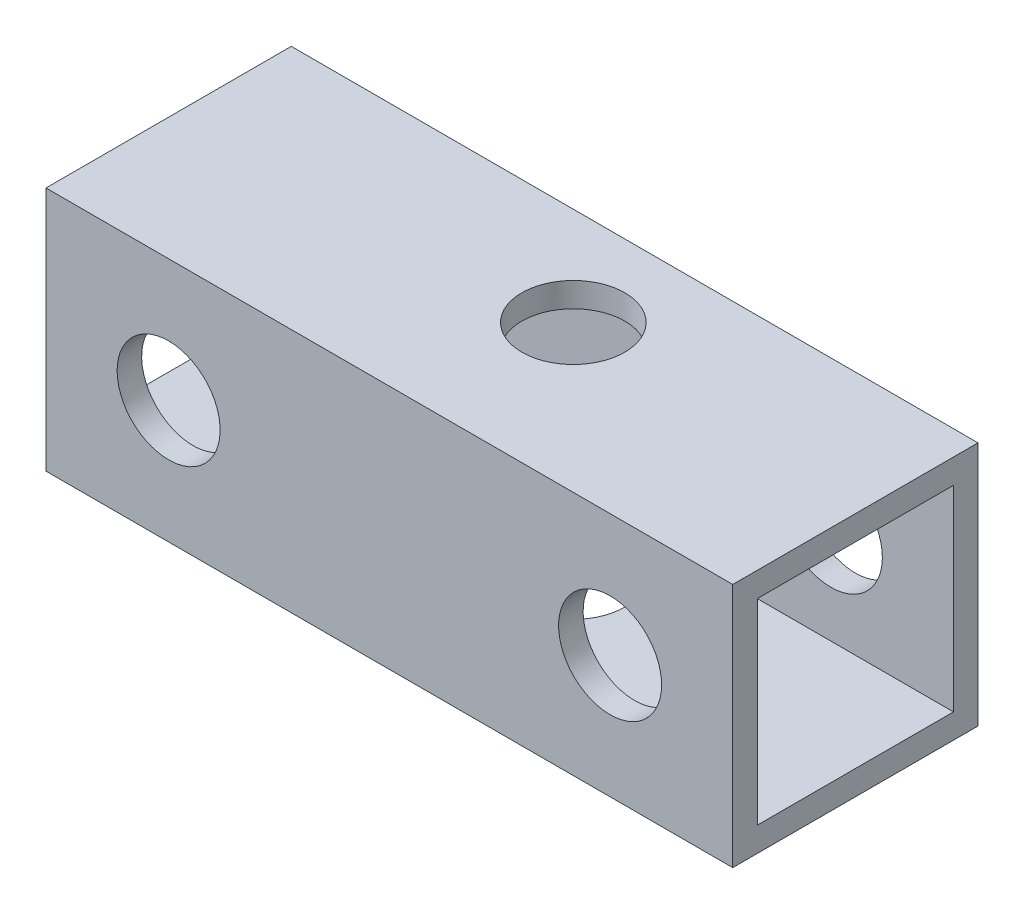
ISO-10303-21;
HEADER;
FILE_DESCRIPTION(('STEP AP214'),'2;1');
FILE_NAME('part.step','',(''),(''),'','','');
FILE_SCHEMA(('AUTOMOTIVE_DESIGN { 1 0 10303 214 1 1 1 1 }'));
ENDSEC;
DATA;
#1=APPLICATION_CONTEXT('core data for automotive mechanical design processes');
#2=APPLICATION_PROTOCOL_DEFINITION('international standard','automotive_design',2000,#1);
#3=PRODUCT_CONTEXT('',#1,'mechanical');
#4=PRODUCT('Part','Part','',(#3));
#5=PRODUCT_RELATED_PRODUCT_CATEGORY('part','',(#4));
#6=PRODUCT_DEFINITION_FORMATION('','',#4);
#7=PRODUCT_DEFINITION_CONTEXT('part definition',#1,'design');
#8=PRODUCT_DEFINITION('design','',#6,#7);
#9=PRODUCT_DEFINITION_SHAPE('','',#8);
#10=(LENGTH_UNIT() NAMED_UNIT(*) SI_UNIT(.MILLI.,.METRE.));
#11=(NAMED_UNIT(*) PLANE_ANGLE_UNIT() SI_UNIT($,.RADIAN.));
#12=(NAMED_UNIT(*) SI_UNIT($,.STERADIAN.) SOLID_ANGLE_UNIT());
#13=UNCERTAINTY_MEASURE_WITH_UNIT(LENGTH_MEASURE(1.E-05),#10,'distance_accuracy_value','');
#14=(GEOMETRIC_REPRESENTATION_CONTEXT(3) GLOBAL_UNCERTAINTY_ASSIGNED_CONTEXT((#13)) GLOBAL_UNIT_ASSIGNED_CONTEXT((#10,
#11,#12)) REPRESENTATION_CONTEXT('',''));
#15=CARTESIAN_POINT('',(0.,0.,0.));
#16=DIRECTION('',(0.,0.,1.));
#17=DIRECTION('',(1.,0.,0.));
#18=AXIS2_PLACEMENT_3D('',#15,#16,#17);
#19=CARTESIAN_POINT('',(28.,5.,-4.));
#20=DIRECTION('',(0.,0.,1.));
#21=DIRECTION('',(0.,-1.,0.));
#22=AXIS2_PLACEMENT_3D('',#19,#20,#21);
#23=PLANE('',#22);
#24=CARTESIAN_POINT('',(5.,0.,-4.));
#25=DIRECTION('',(0.,0.,-1.));
#26=DIRECTION('',(0.,1.,0.));
#27=AXIS2_PLACEMENT_3D('',#24,#25,#26);
#28=CIRCLE('',#27,4.);
#29=CARTESIAN_POINT('',(5.,4.,-4.));
#30=VERTEX_POINT('',#29);
#31=CARTESIAN_POINT('',(5.,-4.,-4.));
#32=VERTEX_POINT('',#31);
#33=EDGE_CURVE('E74',#30,#32,#28,.T.);
#34=ORIENTED_EDGE('',*,*,#33,.T.);
#35=DIRECTION('',(-1.,0.,0.));
#36=VECTOR('',#35,1.);
#37=CARTESIAN_POINT('',(28.,-4.,-4.));
#38=LINE('',#37,#36);
#39=CARTESIAN_POINT('',(28.,-4.,-4.));
#40=VERTEX_POINT('',#39);
#41=EDGE_CURVE('E141',#40,#32,#38,.T.);
#42=ORIENTED_EDGE('',*,*,#41,.F.);
#43=DIRECTION('',(0.,1.,0.));
#44=VECTOR('',#43,1.);
#45=CARTESIAN_POINT('',(28.,5.,-4.));
#46=LINE('',#45,#44);
#47=CARTESIAN_POINT('',(28.,4.,-4.));
#48=VERTEX_POINT('',#47);
#49=EDGE_CURVE('E209',#40,#48,#46,.T.);
#50=ORIENTED_EDGE('',*,*,#49,.T.);
#51=DIRECTION('',(-1.,0.,0.));
#52=VECTOR('',#51,1.);
#53=CARTESIAN_POINT('',(28.,4.,-4.));
#54=LINE('',#53,#52);
#55=EDGE_CURVE('E144',#48,#30,#54,.T.);
#56=ORIENTED_EDGE('',*,*,#55,.T.);
#57=EDGE_LOOP('',(#34,#42,#50,#56));
#58=FACE_BOUND('',#57,.T.);
#59=CARTESIAN_POINT('',(23.,0.,-4.));
#60=DIRECTION('',(0.,0.,1.));
#61=DIRECTION('',(0.,-1.,0.));
#62=AXIS2_PLACEMENT_3D('',#59,#60,#61);
#63=CIRCLE('',#62,2.1);
#64=CARTESIAN_POINT('',(23.,-2.1,-4.));
#65=VERTEX_POINT('',#64);
#66=EDGE_CURVE('E196',#65,#65,#63,.T.);
#67=ORIENTED_EDGE('',*,*,#66,.F.);
#68=EDGE_LOOP('',(#67));
#69=FACE_BOUND('',#68,.T.);
#70=ADVANCED_FACE('F58',(#58,#69),#23,.T.);
#71=CARTESIAN_POINT('',(28.,0.,0.));
#72=DIRECTION('',(1.,0.,0.));
#73=DIRECTION('',(0.,0.,-1.));
#74=AXIS2_PLACEMENT_3D('',#71,#72,#73);
#75=PLANE('',#74);
#76=DIRECTION('',(0.,1.,0.));
#77=VECTOR('',#76,1.);
#78=CARTESIAN_POINT('',(28.,5.,-5.));
#79=LINE('',#78,#77);
#80=CARTESIAN_POINT('',(28.,-5.,-5.));
#81=VERTEX_POINT('',#80);
#82=CARTESIAN_POINT('',(28.,5.,-5.));
#83=VERTEX_POINT('',#82);
#84=EDGE_CURVE('E166',#81,#83,#79,.T.);
#85=ORIENTED_EDGE('',*,*,#84,.T.);
#86=DIRECTION('',(0.,0.,1.));
#87=VECTOR('',#86,1.);
#88=CARTESIAN_POINT('',(28.,5.,5.));
#89=LINE('',#88,#87);
#90=CARTESIAN_POINT('',(28.,5.,5.));
#91=VERTEX_POINT('',#90);
#92=EDGE_CURVE('E169',#83,#91,#89,.T.);
#93=ORIENTED_EDGE('',*,*,#92,.T.);
#94=DIRECTION('',(0.,-1.,0.));
#95=VECTOR('',#94,1.);
#96=CARTESIAN_POINT('',(28.,5.,5.));
#97=LINE('',#96,#95);
#98=CARTESIAN_POINT('',(28.,-5.,5.));
#99=VERTEX_POINT('',#98);
#100=EDGE_CURVE('E172',#91,#99,#97,.T.);
#101=ORIENTED_EDGE('',*,*,#100,.T.);
#102=DIRECTION('',(0.,0.,-1.));
#103=VECTOR('',#102,1.);
#104=CARTESIAN_POINT('',(28.,-5.,5.));
#105=LINE('',#104,#103);
#106=EDGE_CURVE('E174',#99,#81,#105,.T.);
#107=ORIENTED_EDGE('',*,*,#106,.T.);
#108=EDGE_LOOP('',(#85,#93,#101,#107));
#109=FACE_BOUND('',#108,.T.);
#110=DIRECTION('',(0.,0.,1.));
#111=VECTOR('',#110,1.);
#112=CARTESIAN_POINT('',(28.,4.,5.));
#113=LINE('',#112,#111);
#114=CARTESIAN_POINT('',(28.,4.,4.));
#115=VERTEX_POINT('',#114);
#116=EDGE_CURVE('E211',#48,#115,#113,.T.);
#117=ORIENTED_EDGE('',*,*,#116,.F.);
#118=ORIENTED_EDGE('',*,*,#49,.F.);
#119=DIRECTION('',(0.,0.,-1.));
#120=VECTOR('',#119,1.);
#121=CARTESIAN_POINT('',(28.,-4.,5.));
#122=LINE('',#121,#120);
#123=CARTESIAN_POINT('',(28.,-4.,4.));
#124=VERTEX_POINT('',#123);
#125=EDGE_CURVE('E152',#124,#40,#122,.T.);
#126=ORIENTED_EDGE('',*,*,#125,.F.);
#127=DIRECTION('',(0.,-1.,0.));
#128=VECTOR('',#127,1.);
#129=CARTESIAN_POINT('',(28.,5.,4.));
#130=LINE('',#129,#128);
#131=EDGE_CURVE('E213',#115,#124,#130,.T.);
#132=ORIENTED_EDGE('',*,*,#131,.F.);
#133=EDGE_LOOP('',(#117,#118,#126,#132));
#134=FACE_BOUND('',#133,.T.);
#135=ADVANCED_FACE('F231',(#109,#134),#75,.T.);
#136=CARTESIAN_POINT('',(0.,0.,0.));
#137=DIRECTION('',(1.,0.,0.));
#138=DIRECTION('',(0.,0.,-1.));
#139=AXIS2_PLACEMENT_3D('',#136,#137,#138);
#140=PLANE('',#139);
#141=DIRECTION('',(0.,1.,0.));
#142=VECTOR('',#141,1.);
#143=CARTESIAN_POINT('',(0.,5.,-5.));
#144=LINE('',#143,#142);
#145=CARTESIAN_POINT('',(0.,-5.,-5.));
#146=VERTEX_POINT('',#145);
#147=CARTESIAN_POINT('',(0.,5.,-5.));
#148=VERTEX_POINT('',#147);
#149=EDGE_CURVE('E165',#146,#148,#144,.T.);
#150=ORIENTED_EDGE('',*,*,#149,.F.);
#151=DIRECTION('',(0.,0.,-1.));
#152=VECTOR('',#151,1.);
#153=CARTESIAN_POINT('',(0.,-5.,5.));
#154=LINE('',#153,#152);
#155=CARTESIAN_POINT('',(0.,-5.,5.));
#156=VERTEX_POINT('',#155);
#157=EDGE_CURVE('E170',#156,#146,#154,.T.);
#158=ORIENTED_EDGE('',*,*,#157,.F.);
#159=DIRECTION('',(0.,-1.,0.));
#160=VECTOR('',#159,1.);
#161=CARTESIAN_POINT('',(0.,5.,5.));
#162=LINE('',#161,#160);
#163=CARTESIAN_POINT('',(0.,5.,5.));
#164=VERTEX_POINT('',#163);
#165=EDGE_CURVE('E181',#164,#156,#162,.T.);
#166=ORIENTED_EDGE('',*,*,#165,.F.);
#167=DIRECTION('',(0.,0.,1.));
#168=VECTOR('',#167,1.);
#169=CARTESIAN_POINT('',(0.,5.,5.));
#170=LINE('',#169,#168);
#171=EDGE_CURVE('E179',#148,#164,#170,.T.);
#172=ORIENTED_EDGE('',*,*,#171,.F.);
#173=EDGE_LOOP('',(#150,#158,#166,#172));
#174=FACE_BOUND('',#173,.T.);
#175=DIRECTION('',(0.,1.,0.));
#176=VECTOR('',#175,1.);
#177=CARTESIAN_POINT('',(0.,5.,-4.));
#178=LINE('',#177,#176);
#179=CARTESIAN_POINT('',(0.,-4.,-4.));
#180=VERTEX_POINT('',#179);
#181=CARTESIAN_POINT('',(0.,4.,-4.));
#182=VERTEX_POINT('',#181);
#183=EDGE_CURVE('E150',#180,#182,#178,.T.);
#184=ORIENTED_EDGE('',*,*,#183,.T.);
#185=DIRECTION('',(0.,0.,1.));
#186=VECTOR('',#185,1.);
#187=CARTESIAN_POINT('',(0.,4.,5.));
#188=LINE('',#187,#186);
#189=CARTESIAN_POINT('',(0.,4.,4.));
#190=VERTEX_POINT('',#189);
#191=EDGE_CURVE('E203',#182,#190,#188,.T.);
#192=ORIENTED_EDGE('',*,*,#191,.T.);
#193=DIRECTION('',(0.,-1.,0.));
#194=VECTOR('',#193,1.);
#195=CARTESIAN_POINT('',(0.,5.,4.));
#196=LINE('',#195,#194);
#197=CARTESIAN_POINT('',(0.,-4.,4.));
#198=VERTEX_POINT('',#197);
#199=EDGE_CURVE('E217',#190,#198,#196,.T.);
#200=ORIENTED_EDGE('',*,*,#199,.T.);
#201=DIRECTION('',(0.,0.,-1.));
#202=VECTOR('',#201,1.);
#203=CARTESIAN_POINT('',(0.,-4.,5.));
#204=LINE('',#203,#202);
#205=EDGE_CURVE('E159',#198,#180,#204,.T.);
#206=ORIENTED_EDGE('',*,*,#205,.T.);
#207=EDGE_LOOP('',(#184,#192,#200,#206));
#208=FACE_BOUND('',#207,.T.);
#209=ADVANCED_FACE('F221',(#174,#208),#140,.F.);
#210=CARTESIAN_POINT('',(28.,5.,-5.));
#211=DIRECTION('',(0.,0.,1.));
#212=DIRECTION('',(0.,-1.,0.));
#213=AXIS2_PLACEMENT_3D('',#210,#211,#212);
#214=PLANE('',#213);
#215=CARTESIAN_POINT('',(5.,0.,-5.));
#216=DIRECTION('',(0.,0.,-1.));
#217=DIRECTION('',(0.,1.,0.));
#218=AXIS2_PLACEMENT_3D('',#215,#216,#217);
#219=CIRCLE('',#218,4.);
#220=CARTESIAN_POINT('',(5.,4.,-5.));
#221=VERTEX_POINT('',#220);
#222=EDGE_CURVE('E134',#221,#221,#219,.T.);
#223=ORIENTED_EDGE('',*,*,#222,.F.);
#224=EDGE_LOOP('',(#223));
#225=FACE_BOUND('',#224,.T.);
#226=CARTESIAN_POINT('',(23.,0.,-5.));
#227=DIRECTION('',(0.,0.,1.));
#228=DIRECTION('',(1.,0.,0.));
#229=AXIS2_PLACEMENT_3D('',#226,#227,#228);
#230=CIRCLE('',#229,2.1);
#231=CARTESIAN_POINT('',(25.1,0.,-5.));
#232=VERTEX_POINT('',#231);
#233=EDGE_CURVE('E194',#232,#232,#230,.T.);
#234=ORIENTED_EDGE('',*,*,#233,.T.);
#235=EDGE_LOOP('',(#234));
#236=FACE_BOUND('',#235,.T.);
#237=ORIENTED_EDGE('',*,*,#149,.T.);
#238=DIRECTION('',(-1.,0.,0.));
#239=VECTOR('',#238,1.);
#240=CARTESIAN_POINT('',(28.,5.,-5.));
#241=LINE('',#240,#239);
#242=EDGE_CURVE('E12',#83,#148,#241,.T.);
#243=ORIENTED_EDGE('',*,*,#242,.F.);
#244=ORIENTED_EDGE('',*,*,#84,.F.);
#245=DIRECTION('',(-1.,0.,0.));
#246=VECTOR('',#245,1.);
#247=CARTESIAN_POINT('',(28.,-5.,-5.));
#248=LINE('',#247,#246);
#249=EDGE_CURVE('E176',#81,#146,#248,.T.);
#250=ORIENTED_EDGE('',*,*,#249,.T.);
#251=EDGE_LOOP('',(#237,#243,#244,#250));
#252=FACE_BOUND('',#251,.T.);
#253=ADVANCED_FACE('F60',(#225,#236,#252),#214,.F.);
#254=CARTESIAN_POINT('',(28.,5.,5.));
#255=DIRECTION('',(0.,-1.,0.));
#256=DIRECTION('',(0.,0.,-1.));
#257=AXIS2_PLACEMENT_3D('',#254,#255,#256);
#258=PLANE('',#257);
#259=CARTESIAN_POINT('',(15.5,5.,-0.999999999999999));
#260=DIRECTION('',(0.,1.,0.));
#261=DIRECTION('',(0.,0.,1.));
#262=AXIS2_PLACEMENT_3D('',#259,#260,#261);
#263=CIRCLE('',#262,2.1);
#264=CARTESIAN_POINT('',(15.5,5.,1.1));
#265=VERTEX_POINT('',#264);
#266=EDGE_CURVE('E145',#265,#265,#263,.T.);
#267=ORIENTED_EDGE('',*,*,#266,.F.);
#268=EDGE_LOOP('',(#267));
#269=FACE_BOUND('',#268,.T.);
#270=ORIENTED_EDGE('',*,*,#171,.T.);
#271=DIRECTION('',(-1.,0.,0.));
#272=VECTOR('',#271,1.);
#273=CARTESIAN_POINT('',(28.,5.,5.));
#274=LINE('',#273,#272);
#275=EDGE_CURVE('E67',#91,#164,#274,.T.);
#276=ORIENTED_EDGE('',*,*,#275,.F.);
#277=ORIENTED_EDGE('',*,*,#92,.F.);
#278=ORIENTED_EDGE('',*,*,#242,.T.);
#279=EDGE_LOOP('',(#270,#276,#277,#278));
#280=FACE_BOUND('',#279,.T.);
#281=ADVANCED_FACE('F250',(#269,#280),#258,.F.);
#282=CARTESIAN_POINT('',(28.,5.,5.));
#283=DIRECTION('',(0.,0.,-1.));
#284=DIRECTION('',(0.,1.,0.));
#285=AXIS2_PLACEMENT_3D('',#282,#283,#284);
#286=PLANE('',#285);
#287=CARTESIAN_POINT('',(23.,0.,5.));
#288=DIRECTION('',(0.,0.,1.));
#289=DIRECTION('',(1.,0.,0.));
#290=AXIS2_PLACEMENT_3D('',#287,#288,#289);
#291=CIRCLE('',#290,2.1);
#292=CARTESIAN_POINT('',(25.1,0.,5.));
#293=VERTEX_POINT('',#292);
#294=EDGE_CURVE('E285',#293,#293,#291,.T.);
#295=ORIENTED_EDGE('',*,*,#294,.F.);
#296=EDGE_LOOP('',(#295));
#297=FACE_BOUND('',#296,.T.);
#298=CARTESIAN_POINT('',(5.,0.,5.));
#299=DIRECTION('',(0.,0.,1.));
#300=DIRECTION('',(-1.,0.,0.));
#301=AXIS2_PLACEMENT_3D('',#298,#299,#300);
#302=CIRCLE('',#301,2.1);
#303=CARTESIAN_POINT('',(2.9,0.,5.));
#304=VERTEX_POINT('',#303);
#305=EDGE_CURVE('E207',#304,#304,#302,.T.);
#306=ORIENTED_EDGE('',*,*,#305,.F.);
#307=EDGE_LOOP('',(#306));
#308=FACE_BOUND('',#307,.T.);
#309=ORIENTED_EDGE('',*,*,#165,.T.);
#310=DIRECTION('',(-1.,0.,0.));
#311=VECTOR('',#310,1.);
#312=CARTESIAN_POINT('',(28.,-5.,5.));
#313=LINE('',#312,#311);
#314=EDGE_CURVE('E186',#99,#156,#313,.T.);
#315=ORIENTED_EDGE('',*,*,#314,.F.);
#316=ORIENTED_EDGE('',*,*,#100,.F.);
#317=ORIENTED_EDGE('',*,*,#275,.T.);
#318=EDGE_LOOP('',(#309,#315,#316,#317));
#319=FACE_BOUND('',#318,.T.);
#320=ADVANCED_FACE('F247',(#297,#308,#319),#286,.F.);
#321=CARTESIAN_POINT('',(28.,-5.,5.));
#322=DIRECTION('',(0.,1.,0.));
#323=DIRECTION('',(0.,0.,1.));
#324=AXIS2_PLACEMENT_3D('',#321,#322,#323);
#325=PLANE('',#324);
#326=CARTESIAN_POINT('',(15.5,-5.,-0.999999999999999));
#327=DIRECTION('',(0.,1.,0.));
#328=DIRECTION('',(0.,0.,1.));
#329=AXIS2_PLACEMENT_3D('',#326,#327,#328);
#330=CIRCLE('',#329,2.1);
#331=CARTESIAN_POINT('',(15.5,-5.,1.1));
#332=VERTEX_POINT('',#331);
#333=EDGE_CURVE('E275',#332,#332,#330,.T.);
#334=ORIENTED_EDGE('',*,*,#333,.T.);
#335=EDGE_LOOP('',(#334));
#336=FACE_BOUND('',#335,.T.);
#337=ORIENTED_EDGE('',*,*,#157,.T.);
#338=ORIENTED_EDGE('',*,*,#249,.F.);
#339=ORIENTED_EDGE('',*,*,#106,.F.);
#340=ORIENTED_EDGE('',*,*,#314,.T.);
#341=EDGE_LOOP('',(#337,#338,#339,#340));
#342=FACE_BOUND('',#341,.T.);
#343=ADVANCED_FACE('F244',(#336,#342),#325,.F.);
#344=EDGE_CURVE('E128',#32,#30,#28,.T.);
#345=ORIENTED_EDGE('',*,*,#344,.T.);
#346=EDGE_CURVE('E163',#30,#182,#54,.T.);
#347=ORIENTED_EDGE('',*,*,#346,.T.);
#348=ORIENTED_EDGE('',*,*,#183,.F.);
#349=EDGE_CURVE('E147',#32,#180,#38,.T.);
#350=ORIENTED_EDGE('',*,*,#349,.F.);
#351=EDGE_LOOP('',(#345,#347,#348,#350));
#352=FACE_BOUND('',#351,.T.);
#353=ADVANCED_FACE('F148',(#352),#23,.T.);
#354=CARTESIAN_POINT('',(28.,4.,5.));
#355=DIRECTION('',(0.,-1.,0.));
#356=DIRECTION('',(0.,0.,-1.));
#357=AXIS2_PLACEMENT_3D('',#354,#355,#356);
#358=PLANE('',#357);
#359=CARTESIAN_POINT('',(15.5,4.,-0.999999999999999));
#360=DIRECTION('',(0.,-1.,0.));
#361=DIRECTION('',(0.,0.,-1.));
#362=AXIS2_PLACEMENT_3D('',#359,#360,#361);
#363=CIRCLE('',#362,2.1);
#364=CARTESIAN_POINT('',(15.5,4.,-3.1));
#365=VERTEX_POINT('',#364);
#366=EDGE_CURVE('E281',#365,#365,#363,.T.);
#367=ORIENTED_EDGE('',*,*,#366,.F.);
#368=EDGE_LOOP('',(#367));
#369=FACE_BOUND('',#368,.T.);
#370=ORIENTED_EDGE('',*,*,#191,.F.);
#371=ORIENTED_EDGE('',*,*,#346,.F.);
#372=ORIENTED_EDGE('',*,*,#55,.F.);
#373=ORIENTED_EDGE('',*,*,#116,.T.);
#374=DIRECTION('',(-1.,0.,0.));
#375=VECTOR('',#374,1.);
#376=CARTESIAN_POINT('',(28.,4.,4.));
#377=LINE('',#376,#375);
#378=EDGE_CURVE('E156',#115,#190,#377,.T.);
#379=ORIENTED_EDGE('',*,*,#378,.T.);
#380=EDGE_LOOP('',(#370,#371,#372,#373,#379));
#381=FACE_BOUND('',#380,.T.);
#382=ADVANCED_FACE('F224',(#369,#381),#358,.T.);
#383=CARTESIAN_POINT('',(28.,5.,4.));
#384=DIRECTION('',(0.,0.,-1.));
#385=DIRECTION('',(0.,1.,0.));
#386=AXIS2_PLACEMENT_3D('',#383,#384,#385);
#387=PLANE('',#386);
#388=CARTESIAN_POINT('',(23.,0.,4.));
#389=DIRECTION('',(0.,0.,-1.));
#390=DIRECTION('',(0.,1.,0.));
#391=AXIS2_PLACEMENT_3D('',#388,#389,#390);
#392=CIRCLE('',#391,2.1);
#393=CARTESIAN_POINT('',(23.,2.1,4.));
#394=VERTEX_POINT('',#393);
#395=EDGE_CURVE('E193',#394,#394,#392,.T.);
#396=ORIENTED_EDGE('',*,*,#395,.F.);
#397=EDGE_LOOP('',(#396));
#398=FACE_BOUND('',#397,.T.);
#399=CARTESIAN_POINT('',(5.,0.,4.));
#400=DIRECTION('',(0.,0.,-1.));
#401=DIRECTION('',(0.,1.,0.));
#402=AXIS2_PLACEMENT_3D('',#399,#400,#401);
#403=CIRCLE('',#402,2.1);
#404=CARTESIAN_POINT('',(5.,2.1,4.));
#405=VERTEX_POINT('',#404);
#406=EDGE_CURVE('E191',#405,#405,#403,.T.);
#407=ORIENTED_EDGE('',*,*,#406,.F.);
#408=EDGE_LOOP('',(#407));
#409=FACE_BOUND('',#408,.T.);
#410=ORIENTED_EDGE('',*,*,#199,.F.);
#411=ORIENTED_EDGE('',*,*,#378,.F.);
#412=ORIENTED_EDGE('',*,*,#131,.T.);
#413=DIRECTION('',(-1.,0.,0.));
#414=VECTOR('',#413,1.);
#415=CARTESIAN_POINT('',(28.,-4.,4.));
#416=LINE('',#415,#414);
#417=EDGE_CURVE('E82',#124,#198,#416,.T.);
#418=ORIENTED_EDGE('',*,*,#417,.T.);
#419=EDGE_LOOP('',(#410,#411,#412,#418));
#420=FACE_BOUND('',#419,.T.);
#421=ADVANCED_FACE('F229',(#398,#409,#420),#387,.T.);
#422=CARTESIAN_POINT('',(28.,-4.,5.));
#423=DIRECTION('',(0.,1.,0.));
#424=DIRECTION('',(0.,0.,1.));
#425=AXIS2_PLACEMENT_3D('',#422,#423,#424);
#426=PLANE('',#425);
#427=CARTESIAN_POINT('',(15.5,-4.,-0.999999999999999));
#428=DIRECTION('',(0.,1.,0.));
#429=DIRECTION('',(0.,0.,1.));
#430=AXIS2_PLACEMENT_3D('',#427,#428,#429);
#431=CIRCLE('',#430,2.1);
#432=CARTESIAN_POINT('',(15.5,-4.,1.1));
#433=VERTEX_POINT('',#432);
#434=EDGE_CURVE('E62',#433,#433,#431,.T.);
#435=ORIENTED_EDGE('',*,*,#434,.F.);
#436=EDGE_LOOP('',(#435));
#437=FACE_BOUND('',#436,.T.);
#438=ORIENTED_EDGE('',*,*,#205,.F.);
#439=ORIENTED_EDGE('',*,*,#417,.F.);
#440=ORIENTED_EDGE('',*,*,#125,.T.);
#441=ORIENTED_EDGE('',*,*,#41,.T.);
#442=ORIENTED_EDGE('',*,*,#349,.T.);
#443=EDGE_LOOP('',(#438,#439,#440,#441,#442));
#444=FACE_BOUND('',#443,.T.);
#445=ADVANCED_FACE('F154',(#437,#444),#426,.T.);
#446=CARTESIAN_POINT('',(5.,0.,-5.));
#447=DIRECTION('',(0.,0.,1.));
#448=DIRECTION('',(1.,0.,0.));
#449=AXIS2_PLACEMENT_3D('',#446,#447,#448);
#450=CYLINDRICAL_SURFACE('',#449,2.1);
#451=ORIENTED_EDGE('',*,*,#406,.T.);
#452=EDGE_LOOP('',(#451));
#453=FACE_BOUND('',#452,.T.);
#454=ORIENTED_EDGE('',*,*,#305,.T.);
#455=EDGE_LOOP('',(#454));
#456=FACE_BOUND('',#455,.T.);
#457=ADVANCED_FACE('F292',(#453,#456),#450,.F.);
#458=CARTESIAN_POINT('',(23.,0.,-5.));
#459=DIRECTION('',(0.,0.,1.));
#460=DIRECTION('',(1.,0.,0.));
#461=AXIS2_PLACEMENT_3D('',#458,#459,#460);
#462=CYLINDRICAL_SURFACE('',#461,2.1);
#463=ORIENTED_EDGE('',*,*,#395,.T.);
#464=EDGE_LOOP('',(#463));
#465=FACE_BOUND('',#464,.T.);
#466=ORIENTED_EDGE('',*,*,#294,.T.);
#467=EDGE_LOOP('',(#466));
#468=FACE_BOUND('',#467,.T.);
#469=ADVANCED_FACE('F295',(#465,#468),#462,.F.);
#470=ORIENTED_EDGE('',*,*,#66,.T.);
#471=EDGE_LOOP('',(#470));
#472=FACE_BOUND('',#471,.T.);
#473=ORIENTED_EDGE('',*,*,#233,.F.);
#474=EDGE_LOOP('',(#473));
#475=FACE_BOUND('',#474,.T.);
#476=ADVANCED_FACE('F302',(#472,#475),#462,.F.);
#477=CARTESIAN_POINT('',(15.5,-5.,-0.999999999999999));
#478=DIRECTION('',(0.,1.,0.));
#479=DIRECTION('',(0.,0.,1.));
#480=AXIS2_PLACEMENT_3D('',#477,#478,#479);
#481=CYLINDRICAL_SURFACE('',#480,2.1);
#482=ORIENTED_EDGE('',*,*,#434,.T.);
#483=EDGE_LOOP('',(#482));
#484=FACE_BOUND('',#483,.T.);
#485=ORIENTED_EDGE('',*,*,#333,.F.);
#486=EDGE_LOOP('',(#485));
#487=FACE_BOUND('',#486,.T.);
#488=ADVANCED_FACE('F319',(#484,#487),#481,.F.);
#489=ORIENTED_EDGE('',*,*,#366,.T.);
#490=EDGE_LOOP('',(#489));
#491=FACE_BOUND('',#490,.T.);
#492=ORIENTED_EDGE('',*,*,#266,.T.);
#493=EDGE_LOOP('',(#492));
#494=FACE_BOUND('',#493,.T.);
#495=ADVANCED_FACE('F317',(#491,#494),#481,.F.);
#496=CARTESIAN_POINT('',(5.,0.,-4.));
#497=DIRECTION('',(0.,0.,-1.));
#498=DIRECTION('',(0.,1.,0.));
#499=AXIS2_PLACEMENT_3D('',#496,#497,#498);
#500=CYLINDRICAL_SURFACE('',#499,4.);
#501=ORIENTED_EDGE('',*,*,#33,.F.);
#502=ORIENTED_EDGE('',*,*,#344,.F.);
#503=EDGE_LOOP('',(#501,#502));
#504=FACE_BOUND('',#503,.T.);
#505=ORIENTED_EDGE('',*,*,#222,.T.);
#506=EDGE_LOOP('',(#505));
#507=FACE_BOUND('',#506,.T.);
#508=ADVANCED_FACE('F129',(#504,#507),#500,.F.);
#509=CLOSED_SHELL('',(#70,#135,#209,#253,#281,#320,#343,#353,#382,#421,#445,#457,#469,#476,#488,
#495,#508));
#510=MANIFOLD_SOLID_BREP('B2',#509);
#511=ADVANCED_BREP_SHAPE_REPRESENTATION('',(#18,#510),#14);
#512=SHAPE_DEFINITION_REPRESENTATION(#9,#511);
ENDSEC;
END-ISO-10303-21;
